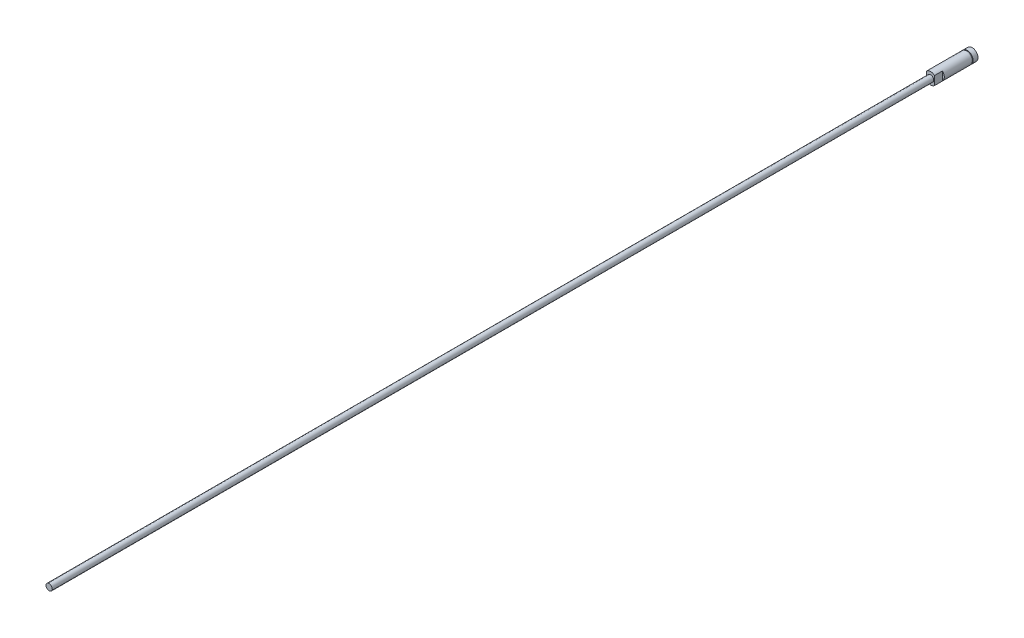
ISO-10303-21;
HEADER;
FILE_DESCRIPTION(('STEP AP214'),'2;1');
FILE_NAME('part.step','',(''),(''),'','','');
FILE_SCHEMA(('AUTOMOTIVE_DESIGN { 1 0 10303 214 1 1 1 1 }'));
ENDSEC;
DATA;
#1=APPLICATION_CONTEXT('core data for automotive mechanical design processes');
#2=APPLICATION_PROTOCOL_DEFINITION('international standard','automotive_design',2000,#1);
#3=PRODUCT_CONTEXT('',#1,'mechanical');
#4=PRODUCT('Part','Part','',(#3));
#5=PRODUCT_RELATED_PRODUCT_CATEGORY('part','',(#4));
#6=PRODUCT_DEFINITION_FORMATION('','',#4);
#7=PRODUCT_DEFINITION_CONTEXT('part definition',#1,'design');
#8=PRODUCT_DEFINITION('design','',#6,#7);
#9=PRODUCT_DEFINITION_SHAPE('','',#8);
#10=(LENGTH_UNIT() NAMED_UNIT(*) SI_UNIT(.MILLI.,.METRE.));
#11=(NAMED_UNIT(*) PLANE_ANGLE_UNIT() SI_UNIT($,.RADIAN.));
#12=(NAMED_UNIT(*) SI_UNIT($,.STERADIAN.) SOLID_ANGLE_UNIT());
#13=UNCERTAINTY_MEASURE_WITH_UNIT(LENGTH_MEASURE(1.E-05),#10,'distance_accuracy_value','');
#14=(GEOMETRIC_REPRESENTATION_CONTEXT(3) GLOBAL_UNCERTAINTY_ASSIGNED_CONTEXT((#13)) GLOBAL_UNIT_ASSIGNED_CONTEXT((#10,
#11,#12)) REPRESENTATION_CONTEXT('',''));
#15=CARTESIAN_POINT('',(0.,0.,0.));
#16=DIRECTION('',(0.,0.,1.));
#17=DIRECTION('',(1.,0.,0.));
#18=AXIS2_PLACEMENT_3D('',#15,#16,#17);
#19=CARTESIAN_POINT('',(0.,0.,17.2));
#20=DIRECTION('',(0.,0.,1.));
#21=DIRECTION('',(1.,0.,0.));
#22=AXIS2_PLACEMENT_3D('',#19,#20,#21);
#23=PLANE('',#22);
#24=CARTESIAN_POINT('',(0.,0.,17.2));
#25=DIRECTION('',(0.,0.,-1.));
#26=DIRECTION('',(-1.,0.,0.));
#27=AXIS2_PLACEMENT_3D('',#24,#25,#26);
#28=CIRCLE('',#27,3.);
#29=CARTESIAN_POINT('',(2.00000000012417,2.23606797738873,17.2));
#30=VERTEX_POINT('',#29);
#31=CARTESIAN_POINT('',(2.00000000012417,-2.23606797738872,17.2));
#32=VERTEX_POINT('',#31);
#33=EDGE_CURVE('E93',#30,#32,#28,.T.);
#34=ORIENTED_EDGE('',*,*,#33,.F.);
#35=DIRECTION('',(0.,1.,0.));
#36=VECTOR('',#35,1.);
#37=CARTESIAN_POINT('',(2.,2.808702216,17.2));
#38=LINE('',#37,#36);
#39=EDGE_CURVE('E100',#32,#30,#38,.T.);
#40=ORIENTED_EDGE('',*,*,#39,.F.);
#41=EDGE_LOOP('',(#34,#40));
#42=FACE_BOUND('',#41,.T.);
#43=ADVANCED_FACE('F36',(#42),#23,.T.);
#44=CARTESIAN_POINT('',(0.,0.,17.2));
#45=DIRECTION('',(0.,0.,1.));
#46=DIRECTION('',(1.,0.,0.));
#47=AXIS2_PLACEMENT_3D('',#44,#45,#46);
#48=PLANE('',#47);
#49=CARTESIAN_POINT('',(0.,0.,17.2));
#50=DIRECTION('',(0.,0.,-1.));
#51=DIRECTION('',(-1.,0.,0.));
#52=AXIS2_PLACEMENT_3D('',#49,#50,#51);
#53=CIRCLE('',#52,3.);
#54=CARTESIAN_POINT('',(-2.00000000012417,-2.23606797738873,17.2));
#55=VERTEX_POINT('',#54);
#56=CARTESIAN_POINT('',(-2.00000000012417,2.23606797738873,17.2));
#57=VERTEX_POINT('',#56);
#58=EDGE_CURVE('E131',#55,#57,#53,.T.);
#59=ORIENTED_EDGE('',*,*,#58,.F.);
#60=DIRECTION('',(0.,1.,0.));
#61=VECTOR('',#60,1.);
#62=CARTESIAN_POINT('',(-2.,2.236067977,17.2));
#63=LINE('',#62,#61);
#64=EDGE_CURVE('E85',#57,#55,#63,.F.);
#65=ORIENTED_EDGE('',*,*,#64,.F.);
#66=EDGE_LOOP('',(#59,#65));
#67=FACE_BOUND('',#66,.T.);
#68=ADVANCED_FACE('F196',(#67),#48,.T.);
#69=CARTESIAN_POINT('',(-2.,2.236067977,17.2));
#70=DIRECTION('',(1.,0.,0.));
#71=DIRECTION('',(0.,0.,-1.));
#72=AXIS2_PLACEMENT_3D('',#69,#70,#71);
#73=PLANE('',#72);
#74=ORIENTED_EDGE('',*,*,#64,.T.);
#75=DIRECTION('',(0.,0.,-1.));
#76=VECTOR('',#75,1.);
#77=CARTESIAN_POINT('',(-2.00000000024835,-2.23606797727766,12.1));
#78=LINE('',#77,#76);
#79=CARTESIAN_POINT('',(-2.00000000012417,-2.23606797738873,21.2));
#80=VERTEX_POINT('',#79);
#81=EDGE_CURVE('E89',#80,#55,#78,.T.);
#82=ORIENTED_EDGE('',*,*,#81,.F.);
#83=DIRECTION('',(0.,1.,0.));
#84=VECTOR('',#83,1.);
#85=CARTESIAN_POINT('',(-2.,0.,21.2));
#86=LINE('',#85,#84);
#87=CARTESIAN_POINT('',(-2.00000000012417,2.23606797738873,21.2));
#88=VERTEX_POINT('',#87);
#89=EDGE_CURVE('E73',#88,#80,#86,.F.);
#90=ORIENTED_EDGE('',*,*,#89,.F.);
#91=DIRECTION('',(0.,0.,1.));
#92=VECTOR('',#91,1.);
#93=CARTESIAN_POINT('',(-2.00000000024835,2.23606797727766,12.1));
#94=LINE('',#93,#92);
#95=EDGE_CURVE('E130',#57,#88,#94,.T.);
#96=ORIENTED_EDGE('',*,*,#95,.F.);
#97=EDGE_LOOP('',(#74,#82,#90,#96));
#98=FACE_BOUND('',#97,.T.);
#99=ADVANCED_FACE('F90',(#98),#73,.F.);
#100=CARTESIAN_POINT('',(0.,0.,21.2));
#101=DIRECTION('',(0.,0.,1.));
#102=DIRECTION('',(1.,0.,0.));
#103=AXIS2_PLACEMENT_3D('',#100,#101,#102);
#104=PLANE('',#103);
#105=CARTESIAN_POINT('',(0.,0.,21.2));
#106=DIRECTION('',(0.,0.,1.));
#107=DIRECTION('',(1.,0.,0.));
#108=AXIS2_PLACEMENT_3D('',#105,#106,#107);
#109=CIRCLE('',#108,1.6);
#110=CARTESIAN_POINT('',(1.6,0.,21.2));
#111=VERTEX_POINT('',#110);
#112=EDGE_CURVE('E310',#111,#111,#109,.T.);
#113=ORIENTED_EDGE('',*,*,#112,.F.);
#114=EDGE_LOOP('',(#113));
#115=FACE_BOUND('',#114,.T.);
#116=ORIENTED_EDGE('',*,*,#89,.T.);
#117=CARTESIAN_POINT('',(0.,0.,21.2));
#118=DIRECTION('',(0.,0.,-1.));
#119=DIRECTION('',(-1.,0.,0.));
#120=AXIS2_PLACEMENT_3D('',#117,#118,#119);
#121=CIRCLE('',#120,3.);
#122=CARTESIAN_POINT('',(2.00000000012417,-2.23606797738872,21.2));
#123=VERTEX_POINT('',#122);
#124=EDGE_CURVE('E77',#123,#80,#121,.T.);
#125=ORIENTED_EDGE('',*,*,#124,.F.);
#126=DIRECTION('',(0.,1.,0.));
#127=VECTOR('',#126,1.);
#128=CARTESIAN_POINT('',(2.,2.808702216,21.2));
#129=LINE('',#128,#127);
#130=CARTESIAN_POINT('',(2.00000000012417,2.23606797738873,21.2));
#131=VERTEX_POINT('',#130);
#132=EDGE_CURVE('E56',#131,#123,#129,.F.);
#133=ORIENTED_EDGE('',*,*,#132,.F.);
#134=CARTESIAN_POINT('',(0.,0.,21.2));
#135=DIRECTION('',(0.,0.,-1.));
#136=DIRECTION('',(-1.,0.,0.));
#137=AXIS2_PLACEMENT_3D('',#134,#135,#136);
#138=CIRCLE('',#137,3.);
#139=EDGE_CURVE('E80',#88,#131,#138,.T.);
#140=ORIENTED_EDGE('',*,*,#139,.F.);
#141=EDGE_LOOP('',(#116,#125,#133,#140));
#142=FACE_BOUND('',#141,.T.);
#143=ADVANCED_FACE('F75',(#115,#142),#104,.T.);
#144=CARTESIAN_POINT('',(2.,2.808702216,17.2));
#145=DIRECTION('',(-1.,0.,0.));
#146=DIRECTION('',(0.,0.,1.));
#147=AXIS2_PLACEMENT_3D('',#144,#145,#146);
#148=PLANE('',#147);
#149=ORIENTED_EDGE('',*,*,#39,.T.);
#150=DIRECTION('',(0.,0.,-1.));
#151=VECTOR('',#150,1.);
#152=CARTESIAN_POINT('',(2.00000000024835,2.23606797727766,12.1));
#153=LINE('',#152,#151);
#154=EDGE_CURVE('E113',#131,#30,#153,.T.);
#155=ORIENTED_EDGE('',*,*,#154,.F.);
#156=ORIENTED_EDGE('',*,*,#132,.T.);
#157=DIRECTION('',(0.,0.,1.));
#158=VECTOR('',#157,1.);
#159=CARTESIAN_POINT('',(2.00000000024835,-2.23606797727766,12.1));
#160=LINE('',#159,#158);
#161=EDGE_CURVE('E98',#32,#123,#160,.T.);
#162=ORIENTED_EDGE('',*,*,#161,.F.);
#163=EDGE_LOOP('',(#149,#155,#156,#162));
#164=FACE_BOUND('',#163,.T.);
#165=ADVANCED_FACE('F135',(#164),#148,.F.);
#166=CARTESIAN_POINT('',(0.,0.,3.));
#167=DIRECTION('',(0.,0.,-1.));
#168=DIRECTION('',(-1.,0.,0.));
#169=AXIS2_PLACEMENT_3D('',#166,#167,#168);
#170=CYLINDRICAL_SURFACE('',#169,3.);
#171=CARTESIAN_POINT('',(0.,0.,3.));
#172=DIRECTION('',(0.,0.,-1.));
#173=DIRECTION('',(-1.,0.,0.));
#174=AXIS2_PLACEMENT_3D('',#171,#172,#173);
#175=CIRCLE('',#174,3.);
#176=CARTESIAN_POINT('',(-3.,0.,3.));
#177=VERTEX_POINT('',#176);
#178=EDGE_CURVE('E127',#177,#177,#175,.T.);
#179=ORIENTED_EDGE('',*,*,#178,.F.);
#180=EDGE_LOOP('',(#179));
#181=FACE_BOUND('',#180,.T.);
#182=ORIENTED_EDGE('',*,*,#139,.T.);
#183=ORIENTED_EDGE('',*,*,#154,.T.);
#184=ORIENTED_EDGE('',*,*,#33,.T.);
#185=ORIENTED_EDGE('',*,*,#161,.T.);
#186=ORIENTED_EDGE('',*,*,#124,.T.);
#187=ORIENTED_EDGE('',*,*,#81,.T.);
#188=ORIENTED_EDGE('',*,*,#58,.T.);
#189=ORIENTED_EDGE('',*,*,#95,.T.);
#190=EDGE_LOOP('',(#182,#183,#184,#185,#186,#187,#188,#189));
#191=FACE_BOUND('',#190,.T.);
#192=ADVANCED_FACE('F95',(#181,#191),#170,.T.);
#193=CARTESIAN_POINT('',(0.,3.,3.));
#194=DIRECTION('',(0.,0.,-1.));
#195=DIRECTION('',(-1.,0.,0.));
#196=AXIS2_PLACEMENT_3D('',#193,#194,#195);
#197=PLANE('',#196);
#198=CARTESIAN_POINT('',(0.,0.,3.));
#199=DIRECTION('',(0.,0.,1.));
#200=DIRECTION('',(1.,0.,0.));
#201=AXIS2_PLACEMENT_3D('',#198,#199,#200);
#202=CIRCLE('',#201,2.711061342);
#203=CARTESIAN_POINT('',(2.711061342,0.,3.));
#204=VERTEX_POINT('',#203);
#205=EDGE_CURVE('E124',#204,#204,#202,.F.);
#206=ORIENTED_EDGE('',*,*,#205,.F.);
#207=EDGE_LOOP('',(#206));
#208=FACE_BOUND('',#207,.T.);
#209=ORIENTED_EDGE('',*,*,#178,.T.);
#210=EDGE_LOOP('',(#209));
#211=FACE_BOUND('',#210,.T.);
#212=ADVANCED_FACE('F142',(#208,#211),#197,.T.);
#213=CARTESIAN_POINT('',(0.,0.,3.));
#214=DIRECTION('',(0.,0.,1.));
#215=DIRECTION('',(1.,0.,0.));
#216=AXIS2_PLACEMENT_3D('',#213,#214,#215);
#217=CYLINDRICAL_SURFACE('',#216,2.711061342);
#218=CARTESIAN_POINT('',(0.,0.,2.5));
#219=DIRECTION('',(0.,0.,1.));
#220=DIRECTION('',(1.,0.,0.));
#221=AXIS2_PLACEMENT_3D('',#218,#219,#220);
#222=CIRCLE('',#221,2.711061342);
#223=CARTESIAN_POINT('',(2.711061342,0.,2.5));
#224=VERTEX_POINT('',#223);
#225=EDGE_CURVE('E121',#224,#224,#222,.F.);
#226=ORIENTED_EDGE('',*,*,#225,.F.);
#227=EDGE_LOOP('',(#226));
#228=FACE_BOUND('',#227,.T.);
#229=ORIENTED_EDGE('',*,*,#205,.T.);
#230=EDGE_LOOP('',(#229));
#231=FACE_BOUND('',#230,.T.);
#232=ADVANCED_FACE('F172',(#228,#231),#217,.T.);
#233=CARTESIAN_POINT('',(0.,3.,2.5));
#234=DIRECTION('',(0.,0.,1.));
#235=DIRECTION('',(1.,0.,0.));
#236=AXIS2_PLACEMENT_3D('',#233,#234,#235);
#237=PLANE('',#236);
#238=ORIENTED_EDGE('',*,*,#225,.T.);
#239=EDGE_LOOP('',(#238));
#240=FACE_BOUND('',#239,.T.);
#241=CARTESIAN_POINT('',(0.,0.,2.5));
#242=DIRECTION('',(0.,0.,-1.));
#243=DIRECTION('',(-1.,0.,0.));
#244=AXIS2_PLACEMENT_3D('',#241,#242,#243);
#245=CIRCLE('',#244,3.);
#246=CARTESIAN_POINT('',(-3.,0.,2.5));
#247=VERTEX_POINT('',#246);
#248=EDGE_CURVE('E47',#247,#247,#245,.T.);
#249=ORIENTED_EDGE('',*,*,#248,.F.);
#250=EDGE_LOOP('',(#249));
#251=FACE_BOUND('',#250,.T.);
#252=ADVANCED_FACE('F163',(#240,#251),#237,.T.);
#253=CARTESIAN_POINT('',(0.,0.,0.));
#254=DIRECTION('',(0.,0.,1.));
#255=DIRECTION('',(1.,0.,0.));
#256=AXIS2_PLACEMENT_3D('',#253,#254,#255);
#257=PLANE('',#256);
#258=CARTESIAN_POINT('',(0.,0.,0.));
#259=DIRECTION('',(0.,0.,-1.));
#260=DIRECTION('',(-1.,0.,0.));
#261=AXIS2_PLACEMENT_3D('',#258,#259,#260);
#262=CIRCLE('',#261,3.);
#263=CARTESIAN_POINT('',(-3.,0.,0.));
#264=VERTEX_POINT('',#263);
#265=EDGE_CURVE('E11',#264,#264,#262,.F.);
#266=ORIENTED_EDGE('',*,*,#265,.F.);
#267=EDGE_LOOP('',(#266));
#268=FACE_BOUND('',#267,.T.);
#269=ADVANCED_FACE('F151',(#268),#257,.F.);
#270=CARTESIAN_POINT('',(0.,0.,0.));
#271=DIRECTION('',(0.,0.,-1.));
#272=DIRECTION('',(-1.,0.,0.));
#273=AXIS2_PLACEMENT_3D('',#270,#271,#272);
#274=CYLINDRICAL_SURFACE('',#273,3.);
#275=ORIENTED_EDGE('',*,*,#265,.T.);
#276=EDGE_LOOP('',(#275));
#277=FACE_BOUND('',#276,.T.);
#278=ORIENTED_EDGE('',*,*,#248,.T.);
#279=EDGE_LOOP('',(#278));
#280=FACE_BOUND('',#279,.T.);
#281=ADVANCED_FACE('F148',(#277,#280),#274,.T.);
#282=CARTESIAN_POINT('',(0.,0.,471.2));
#283=DIRECTION('',(0.,0.,1.));
#284=DIRECTION('',(1.,0.,0.));
#285=AXIS2_PLACEMENT_3D('',#282,#283,#284);
#286=PLANE('',#285);
#287=CARTESIAN_POINT('',(0.,0.,471.2));
#288=DIRECTION('',(0.,0.,1.));
#289=DIRECTION('',(1.,0.,0.));
#290=AXIS2_PLACEMENT_3D('',#287,#288,#289);
#291=CIRCLE('',#290,1.6);
#292=CARTESIAN_POINT('',(1.6,0.,471.2));
#293=VERTEX_POINT('',#292);
#294=EDGE_CURVE('E307',#293,#293,#291,.T.);
#295=ORIENTED_EDGE('',*,*,#294,.T.);
#296=EDGE_LOOP('',(#295));
#297=FACE_BOUND('',#296,.T.);
#298=ADVANCED_FACE('F150',(#297),#286,.T.);
#299=CARTESIAN_POINT('',(0.,0.,471.2));
#300=DIRECTION('',(0.,0.,-1.));
#301=DIRECTION('',(-1.,0.,0.));
#302=AXIS2_PLACEMENT_3D('',#299,#300,#301);
#303=CYLINDRICAL_SURFACE('',#302,1.6);
#304=ORIENTED_EDGE('',*,*,#294,.F.);
#305=EDGE_LOOP('',(#304));
#306=FACE_BOUND('',#305,.T.);
#307=ORIENTED_EDGE('',*,*,#112,.T.);
#308=EDGE_LOOP('',(#307));
#309=FACE_BOUND('',#308,.T.);
#310=ADVANCED_FACE('F160',(#306,#309),#303,.T.);
#311=CLOSED_SHELL('',(#43,#68,#99,#143,#165,#192,#212,#232,#252,#269,#281,#298,#310));
#312=CARTESIAN_POINT('',(0.,0.,21.2));
#313=DIRECTION('',(0.,0.,1.));
#314=DIRECTION('',(1.,0.,0.));
#315=AXIS2_PLACEMENT_3D('',#312,#313,#314);
#316=PLANE('',#315);
#317=CARTESIAN_POINT('',(0.,0.,21.2));
#318=DIRECTION('',(0.,0.,1.));
#319=DIRECTION('',(1.,0.,0.));
#320=AXIS2_PLACEMENT_3D('',#317,#318,#319);
#321=CIRCLE('',#320,1.5);
#322=CARTESIAN_POINT('',(1.5,0.,21.2));
#323=VERTEX_POINT('',#322);
#324=EDGE_CURVE('E84',#323,#323,#321,.F.);
#325=ORIENTED_EDGE('',*,*,#324,.T.);
#326=EDGE_LOOP('',(#325));
#327=FACE_BOUND('',#326,.T.);
#328=ADVANCED_FACE('F237',(#327),#316,.F.);
#329=CARTESIAN_POINT('',(0.,0.,6.2));
#330=DIRECTION('',(0.,0.,1.));
#331=DIRECTION('',(1.,0.,0.));
#332=AXIS2_PLACEMENT_3D('',#329,#330,#331);
#333=PLANE('',#332);
#334=CARTESIAN_POINT('',(0.,0.,6.2));
#335=DIRECTION('',(0.,0.,1.));
#336=DIRECTION('',(1.,0.,0.));
#337=AXIS2_PLACEMENT_3D('',#334,#335,#336);
#338=CIRCLE('',#337,1.3);
#339=CARTESIAN_POINT('',(1.3,0.,6.2));
#340=VERTEX_POINT('',#339);
#341=EDGE_CURVE('E40',#340,#340,#338,.F.);
#342=ORIENTED_EDGE('',*,*,#341,.F.);
#343=EDGE_LOOP('',(#342));
#344=FACE_BOUND('',#343,.T.);
#345=ADVANCED_FACE('F38',(#344),#333,.T.);
#346=CARTESIAN_POINT('',(0.,0.,6.2));
#347=DIRECTION('',(0.,0.,1.));
#348=DIRECTION('',(1.,0.,0.));
#349=AXIS2_PLACEMENT_3D('',#346,#347,#348);
#350=CYLINDRICAL_SURFACE('',#349,1.3);
#351=ORIENTED_EDGE('',*,*,#341,.T.);
#352=EDGE_LOOP('',(#351));
#353=FACE_BOUND('',#352,.T.);
#354=CARTESIAN_POINT('',(0.,0.,21.));
#355=DIRECTION('',(0.,0.,1.));
#356=DIRECTION('',(1.,0.,0.));
#357=AXIS2_PLACEMENT_3D('',#354,#355,#356);
#358=CIRCLE('',#357,1.3);
#359=CARTESIAN_POINT('',(1.3,0.,21.));
#360=VERTEX_POINT('',#359);
#361=EDGE_CURVE('E115',#360,#360,#358,.F.);
#362=ORIENTED_EDGE('',*,*,#361,.F.);
#363=EDGE_LOOP('',(#362));
#364=FACE_BOUND('',#363,.T.);
#365=ADVANCED_FACE('F220',(#353,#364),#350,.F.);
#366=CARTESIAN_POINT('',(0.,0.,21.));
#367=DIRECTION('',(0.,0.,1.));
#368=DIRECTION('',(1.,0.,0.));
#369=AXIS2_PLACEMENT_3D('',#366,#367,#368);
#370=CONICAL_SURFACE('',#369,1.3,0.785398163397451);
#371=ORIENTED_EDGE('',*,*,#361,.T.);
#372=EDGE_LOOP('',(#371));
#373=FACE_BOUND('',#372,.T.);
#374=ORIENTED_EDGE('',*,*,#324,.F.);
#375=EDGE_LOOP('',(#374));
#376=FACE_BOUND('',#375,.T.);
#377=ADVANCED_FACE('F216',(#373,#376),#370,.F.);
#378=CLOSED_SHELL('',(#328,#345,#365,#377));
#379=ORIENTED_CLOSED_SHELL('',*,#378,.T.);
#380=BREP_WITH_VOIDS('B2',#311,(#379));
#381=ADVANCED_BREP_SHAPE_REPRESENTATION('',(#18,#380),#14);
#382=SHAPE_DEFINITION_REPRESENTATION(#9,#381);
ENDSEC;
END-ISO-10303-21;
